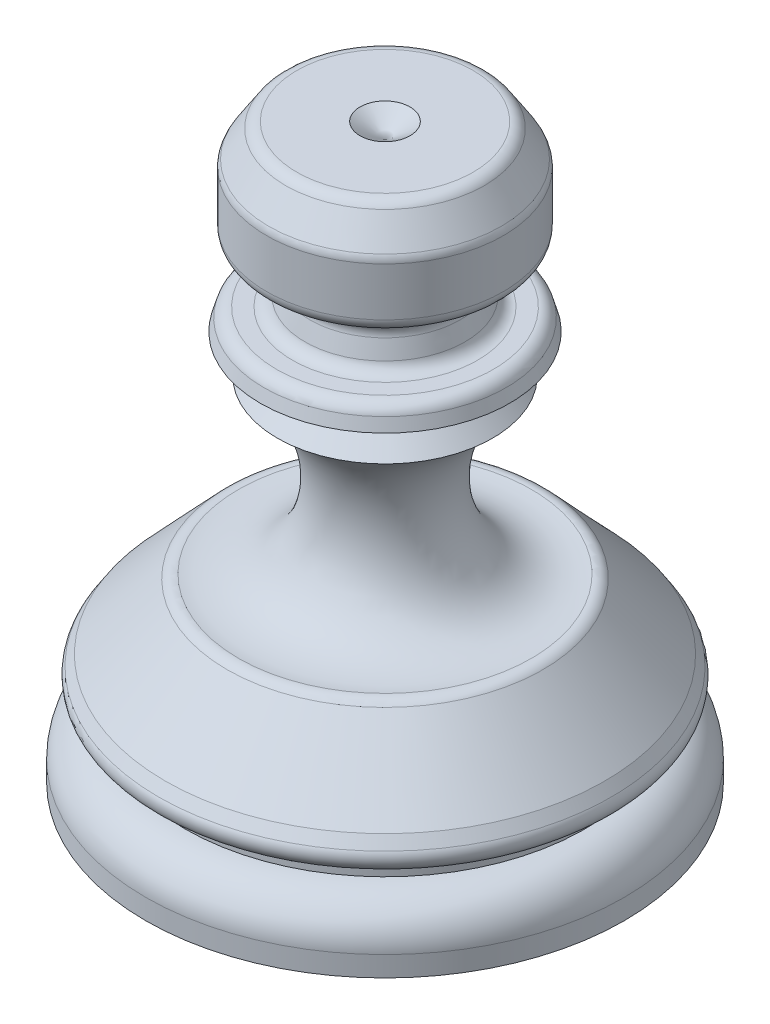
ISO-10303-21;
HEADER;
FILE_DESCRIPTION(('STEP AP214'),'2;1');
FILE_NAME('part.step','',(''),(''),'','','');
FILE_SCHEMA(('AUTOMOTIVE_DESIGN { 1 0 10303 214 1 1 1 1 }'));
ENDSEC;
DATA;
#1=APPLICATION_CONTEXT('core data for automotive mechanical design processes');
#2=APPLICATION_PROTOCOL_DEFINITION('international standard','automotive_design',2000,#1);
#3=PRODUCT_CONTEXT('',#1,'mechanical');
#4=PRODUCT('Part','Part','',(#3));
#5=PRODUCT_RELATED_PRODUCT_CATEGORY('part','',(#4));
#6=PRODUCT_DEFINITION_FORMATION('','',#4);
#7=PRODUCT_DEFINITION_CONTEXT('part definition',#1,'design');
#8=PRODUCT_DEFINITION('design','',#6,#7);
#9=PRODUCT_DEFINITION_SHAPE('','',#8);
#10=(LENGTH_UNIT() NAMED_UNIT(*) SI_UNIT(.MILLI.,.METRE.));
#11=(NAMED_UNIT(*) PLANE_ANGLE_UNIT() SI_UNIT($,.RADIAN.));
#12=(NAMED_UNIT(*) SI_UNIT($,.STERADIAN.) SOLID_ANGLE_UNIT());
#13=UNCERTAINTY_MEASURE_WITH_UNIT(LENGTH_MEASURE(1.E-05),#10,'distance_accuracy_value','');
#14=(GEOMETRIC_REPRESENTATION_CONTEXT(3) GLOBAL_UNCERTAINTY_ASSIGNED_CONTEXT((#13)) GLOBAL_UNIT_ASSIGNED_CONTEXT((#10,
#11,#12)) REPRESENTATION_CONTEXT('',''));
#15=CARTESIAN_POINT('',(0.,0.,0.));
#16=DIRECTION('',(0.,0.,1.));
#17=DIRECTION('',(1.,0.,0.));
#18=AXIS2_PLACEMENT_3D('',#15,#16,#17);
#19=CARTESIAN_POINT('',(0.,42.4652565748765,0.));
#20=DIRECTION('',(0.,1.,0.));
#21=DIRECTION('',(0.,0.,1.));
#22=AXIS2_PLACEMENT_3D('',#19,#20,#21);
#23=CONICAL_SURFACE('',#22,4.81231420290701,1.00227177906386);
#24=CARTESIAN_POINT('',(0.,39.390722500797,0.));
#25=VERTEX_POINT('',#24);
#26=VERTEX_LOOP('',#25);
#27=FACE_BOUND('',#26,.T.);
#28=CARTESIAN_POINT('',(0.,42.4652565748765,0.));
#29=DIRECTION('',(0.,1.,0.));
#30=DIRECTION('',(0.,0.,1.));
#31=AXIS2_PLACEMENT_3D('',#28,#29,#30);
#32=CIRCLE('',#31,4.81231420290701);
#33=CARTESIAN_POINT('',(0.,42.4652565748765,4.81231420290701));
#34=VERTEX_POINT('',#33);
#35=EDGE_CURVE('E49',#34,#34,#32,.T.);
#36=ORIENTED_EDGE('',*,*,#35,.T.);
#37=EDGE_LOOP('',(#36));
#38=FACE_BOUND('',#37,.T.);
#39=ADVANCED_FACE('F33',(#27,#38),#23,.F.);
#40=CARTESIAN_POINT('',(0.,-67.7820476432046,0.));
#41=DIRECTION('',(0.,1.,0.));
#42=DIRECTION('',(0.,0.,1.));
#43=AXIS2_PLACEMENT_3D('',#40,#41,#42);
#44=PLANE('',#43);
#45=CARTESIAN_POINT('',(0.,-67.7820476432046,0.));
#46=DIRECTION('',(0.,1.,0.));
#47=DIRECTION('',(0.,0.,1.));
#48=AXIS2_PLACEMENT_3D('',#45,#46,#47);
#49=CIRCLE('',#48,46.0654692720808);
#50=CARTESIAN_POINT('',(0.,-67.7820476432046,46.0654692720808));
#51=VERTEX_POINT('',#50);
#52=EDGE_CURVE('E75',#51,#51,#49,.T.);
#53=ORIENTED_EDGE('',*,*,#52,.F.);
#54=EDGE_LOOP('',(#53));
#55=FACE_BOUND('',#54,.T.);
#56=ADVANCED_FACE('F45',(#55),#44,.F.);
#57=CARTESIAN_POINT('',(0.,31.9167894242274,0.));
#58=DIRECTION('',(0.,1.,0.));
#59=DIRECTION('',(0.,0.,1.));
#60=AXIS2_PLACEMENT_3D('',#57,#58,#59);
#61=CYLINDRICAL_SURFACE('',#60,46.0654692720808);
#62=CARTESIAN_POINT('',(0.,-63.8855022021132,0.));
#63=DIRECTION('',(0.,1.,0.));
#64=DIRECTION('',(0.,0.,1.));
#65=AXIS2_PLACEMENT_3D('',#62,#63,#64);
#66=CIRCLE('',#65,46.0654692720808);
#67=CARTESIAN_POINT('',(0.,-63.8855022021132,46.0654692720808));
#68=VERTEX_POINT('',#67);
#69=EDGE_CURVE('E120',#68,#68,#66,.F.);
#70=ORIENTED_EDGE('',*,*,#69,.T.);
#71=EDGE_LOOP('',(#70));
#72=FACE_BOUND('',#71,.T.);
#73=ORIENTED_EDGE('',*,*,#52,.T.);
#74=EDGE_LOOP('',(#73));
#75=FACE_BOUND('',#74,.T.);
#76=ADVANCED_FACE('F147',(#72,#75),#61,.T.);
#77=CARTESIAN_POINT('',(0.,31.9167894242274,0.));
#78=DIRECTION('',(0.,1.,0.));
#79=DIRECTION('',(0.,0.,1.));
#80=AXIS2_PLACEMENT_3D('',#77,#78,#79);
#81=CYLINDRICAL_SURFACE('',#80,38.4975707488104);
#82=CARTESIAN_POINT('',(0.,-52.3172115304347,0.));
#83=DIRECTION('',(0.,1.,0.));
#84=DIRECTION('',(0.,0.,1.));
#85=AXIS2_PLACEMENT_3D('',#82,#83,#84);
#86=CIRCLE('',#85,38.4975707488104);
#87=CARTESIAN_POINT('',(0.,-52.3172115304347,38.4975707488104));
#88=VERTEX_POINT('',#87);
#89=EDGE_CURVE('E69',#88,#88,#86,.T.);
#90=ORIENTED_EDGE('',*,*,#89,.F.);
#91=EDGE_LOOP('',(#90));
#92=FACE_BOUND('',#91,.T.);
#93=CARTESIAN_POINT('',(0.,-56.2656803251844,0.));
#94=DIRECTION('',(0.,1.,0.));
#95=DIRECTION('',(0.,0.,1.));
#96=AXIS2_PLACEMENT_3D('',#93,#94,#95);
#97=CIRCLE('',#96,38.4975707488104);
#98=CARTESIAN_POINT('',(0.,-56.2656803251844,38.4975707488104));
#99=VERTEX_POINT('',#98);
#100=EDGE_CURVE('E72',#99,#99,#97,.T.);
#101=ORIENTED_EDGE('',*,*,#100,.T.);
#102=EDGE_LOOP('',(#101));
#103=FACE_BOUND('',#102,.T.);
#104=ADVANCED_FACE('F141',(#92,#103),#81,.T.);
#105=CARTESIAN_POINT('',(38.4975707488104,-52.3172115304347,0.));
#106=DIRECTION('',(0.,1.,0.));
#107=DIRECTION('',(0.,0.,1.));
#108=AXIS2_PLACEMENT_3D('',#105,#106,#107);
#109=PLANE('',#108);
#110=CARTESIAN_POINT('',(0.,-52.3172115304347,0.));
#111=DIRECTION('',(0.,1.,0.));
#112=DIRECTION('',(0.,0.,1.));
#113=AXIS2_PLACEMENT_3D('',#110,#111,#112);
#114=CIRCLE('',#113,41.4285568397049);
#115=CARTESIAN_POINT('',(0.,-52.3172115304347,41.4285568397049));
#116=VERTEX_POINT('',#115);
#117=EDGE_CURVE('E11',#116,#116,#114,.F.);
#118=ORIENTED_EDGE('',*,*,#117,.T.);
#119=EDGE_LOOP('',(#118));
#120=FACE_BOUND('',#119,.T.);
#121=ORIENTED_EDGE('',*,*,#89,.T.);
#122=EDGE_LOOP('',(#121));
#123=FACE_BOUND('',#122,.T.);
#124=ADVANCED_FACE('F138',(#120,#123),#109,.F.);
#125=CARTESIAN_POINT('',(0.,-52.3172115304347,0.));
#126=DIRECTION('',(0.,-1.,0.));
#127=DIRECTION('',(0.,0.,-1.));
#128=AXIS2_PLACEMENT_3D('',#125,#126,#127);
#129=CONICAL_SURFACE('',#128,46.0654692720808,0.568524547731041);
#130=CARTESIAN_POINT('',(0.,-48.4097027665951,0.));
#131=DIRECTION('',(0.,1.,0.));
#132=DIRECTION('',(0.,0.,1.));
#133=AXIS2_PLACEMENT_3D('',#130,#131,#132);
#134=CIRCLE('',#133,43.5690053396278);
#135=CARTESIAN_POINT('',(0.,-48.4097027665951,43.5690053396278));
#136=VERTEX_POINT('',#135);
#137=EDGE_CURVE('E40',#136,#136,#134,.T.);
#138=ORIENTED_EDGE('',*,*,#137,.T.);
#139=EDGE_LOOP('',(#138));
#140=FACE_BOUND('',#139,.T.);
#141=CARTESIAN_POINT('',(0.,-46.39450833831,0.));
#142=DIRECTION('',(0.,1.,0.));
#143=DIRECTION('',(0.,0.,1.));
#144=AXIS2_PLACEMENT_3D('',#141,#142,#143);
#145=CIRCLE('',#144,42.2815200104456);
#146=CARTESIAN_POINT('',(0.,-46.39450833831,42.2815200104456));
#147=VERTEX_POINT('',#146);
#148=EDGE_CURVE('E66',#147,#147,#145,.T.);
#149=ORIENTED_EDGE('',*,*,#148,.F.);
#150=EDGE_LOOP('',(#149));
#151=FACE_BOUND('',#150,.T.);
#152=ADVANCED_FACE('F125',(#140,#151),#129,.T.);
#153=CARTESIAN_POINT('',(0.,-38.1685316825813,0.));
#154=DIRECTION('',(0.,-1.,0.));
#155=DIRECTION('',(0.,0.,-1.));
#156=AXIS2_PLACEMENT_3D('',#153,#154,#155);
#157=CONICAL_SURFACE('',#156,34.5491019540606,0.754480183834404);
#158=CARTESIAN_POINT('',(0.,-33.7551049656459,0.));
#159=DIRECTION('',(0.,1.,0.));
#160=DIRECTION('',(0.,0.,1.));
#161=AXIS2_PLACEMENT_3D('',#158,#159,#160);
#162=CIRCLE('',#161,30.4004808401414);
#163=CARTESIAN_POINT('',(0.,-33.7551049656459,30.4004808401414));
#164=VERTEX_POINT('',#163);
#165=EDGE_CURVE('E117',#164,#164,#162,.F.);
#166=ORIENTED_EDGE('',*,*,#165,.T.);
#167=EDGE_LOOP('',(#166));
#168=FACE_BOUND('',#167,.T.);
#169=ORIENTED_EDGE('',*,*,#148,.T.);
#170=EDGE_LOOP('',(#169));
#171=FACE_BOUND('',#170,.T.);
#172=ADVANCED_FACE('F198',(#168,#171),#157,.T.);
#173=CARTESIAN_POINT('',(29.4620280235699,-32.7567509054635,0.));
#174=CARTESIAN_POINT('',(8.48706314067127,-37.0843237440966,0.));
#175=CARTESIAN_POINT('',(6.20876496623018,-6.64463608650512,0.));
#176=CARTESIAN_POINT('',(20.7294611724363,0.,0.));
#177=B_SPLINE_CURVE_WITH_KNOTS('',3,(#173,#174,#175,#176),.UNSPECIFIED.,.F.,.F.,(4,4),(0.,1.),.UNSPECIFIED.);
#178=CARTESIAN_POINT('',(0.,31.9167894242274,0.));
#179=DIRECTION('',(0.,1.,0.));
#180=AXIS1_PLACEMENT('',#178,#179);
#181=SURFACE_OF_REVOLUTION('',#177,#180);
#182=CARTESIAN_POINT('',(0.,-32.9808425191846,0.));
#183=DIRECTION('',(0.,1.,0.));
#184=DIRECTION('',(0.,0.,1.));
#185=AXIS2_PLACEMENT_3D('',#182,#183,#184);
#186=CIRCLE('',#185,28.1868113247116);
#187=CARTESIAN_POINT('',(0.,-32.9808425191846,28.1868113247116));
#188=VERTEX_POINT('',#187);
#189=EDGE_CURVE('E114',#188,#188,#186,.T.);
#190=ORIENTED_EDGE('',*,*,#189,.T.);
#191=EDGE_LOOP('',(#190));
#192=FACE_BOUND('',#191,.T.);
#193=CARTESIAN_POINT('',(0.,0.,0.));
#194=DIRECTION('',(0.,1.,0.));
#195=DIRECTION('',(0.,0.,1.));
#196=AXIS2_PLACEMENT_3D('',#193,#194,#195);
#197=CIRCLE('',#196,20.7294611724363);
#198=CARTESIAN_POINT('',(0.,0.,20.7294611724363));
#199=VERTEX_POINT('',#198);
#200=EDGE_CURVE('E63',#199,#199,#197,.T.);
#201=ORIENTED_EDGE('',*,*,#200,.F.);
#202=EDGE_LOOP('',(#201));
#203=FACE_BOUND('',#202,.T.);
#204=ADVANCED_FACE('F194',(#192,#203),#181,.T.);
#205=CARTESIAN_POINT('',(0.,0.,0.));
#206=DIRECTION('',(0.,-1.,0.));
#207=DIRECTION('',(0.,0.,-1.));
#208=AXIS2_PLACEMENT_3D('',#205,#206,#207);
#209=CONICAL_SURFACE('',#208,20.7294611724363,0.754480183834404);
#210=CARTESIAN_POINT('',(0.,5.10433293438933,0.));
#211=DIRECTION('',(0.,1.,0.));
#212=DIRECTION('',(0.,0.,1.));
#213=AXIS2_PLACEMENT_3D('',#210,#211,#212);
#214=CIRCLE('',#213,15.9313882141104);
#215=CARTESIAN_POINT('',(0.,5.10433293438933,15.9313882141104));
#216=VERTEX_POINT('',#215);
#217=EDGE_CURVE('E54',#216,#216,#214,.T.);
#218=ORIENTED_EDGE('',*,*,#217,.F.);
#219=EDGE_LOOP('',(#218));
#220=FACE_BOUND('',#219,.T.);
#221=ORIENTED_EDGE('',*,*,#200,.T.);
#222=EDGE_LOOP('',(#221));
#223=FACE_BOUND('',#222,.T.);
#224=ADVANCED_FACE('F197',(#220,#223),#209,.T.);
#225=CARTESIAN_POINT('',(0.,5.10433293438933,0.));
#226=DIRECTION('',(0.,1.,0.));
#227=DIRECTION('',(0.,0.,1.));
#228=AXIS2_PLACEMENT_3D('',#225,#226,#227);
#229=CONICAL_SURFACE('',#228,15.9313882141104,1.28856748082058);
#230=CARTESIAN_POINT('',(0.,7.44071070165423,0.));
#231=DIRECTION('',(0.,1.,0.));
#232=DIRECTION('',(0.,0.,1.));
#233=AXIS2_PLACEMENT_3D('',#230,#231,#232);
#234=CIRCLE('',#233,23.9887239913892);
#235=CARTESIAN_POINT('',(0.,7.44071070165423,23.9887239913892));
#236=VERTEX_POINT('',#235);
#237=EDGE_CURVE('E51',#236,#236,#234,.T.);
#238=ORIENTED_EDGE('',*,*,#237,.F.);
#239=EDGE_LOOP('',(#238));
#240=FACE_BOUND('',#239,.T.);
#241=ORIENTED_EDGE('',*,*,#217,.T.);
#242=EDGE_LOOP('',(#241));
#243=FACE_BOUND('',#242,.T.);
#244=ADVANCED_FACE('F203',(#240,#243),#229,.T.);
#245=CARTESIAN_POINT('',(0.,7.44071070165423,0.));
#246=DIRECTION('',(0.,-1.,0.));
#247=DIRECTION('',(0.,0.,-1.));
#248=AXIS2_PLACEMENT_3D('',#245,#246,#247);
#249=CONICAL_SURFACE('',#248,23.9887239913892,0.282228845974315);
#250=CARTESIAN_POINT('',(0.,9.72379143887595,0.));
#251=DIRECTION('',(0.,1.,0.));
#252=DIRECTION('',(0.,0.,1.));
#253=AXIS2_PLACEMENT_3D('',#250,#251,#252);
#254=CIRCLE('',#253,23.3267013051363);
#255=CARTESIAN_POINT('',(0.,9.72379143887595,23.3267013051363));
#256=VERTEX_POINT('',#255);
#257=EDGE_CURVE('E84',#256,#256,#254,.F.);
#258=ORIENTED_EDGE('',*,*,#257,.T.);
#259=EDGE_LOOP('',(#258));
#260=FACE_BOUND('',#259,.T.);
#261=ORIENTED_EDGE('',*,*,#237,.T.);
#262=EDGE_LOOP('',(#261));
#263=FACE_BOUND('',#262,.T.);
#264=ADVANCED_FACE('F209',(#260,#263),#249,.T.);
#265=CARTESIAN_POINT('',(22.7952989715946,11.5564090464245,0.));
#266=DIRECTION('',(0.,-1.,0.));
#267=DIRECTION('',(0.,0.,-1.));
#268=AXIS2_PLACEMENT_3D('',#265,#266,#267);
#269=PLANE('',#268);
#270=CARTESIAN_POINT('',(0.,11.5564090464245,0.));
#271=DIRECTION('',(0.,-1.,0.));
#272=DIRECTION('',(0.,0.,-1.));
#273=AXIS2_PLACEMENT_3D('',#270,#271,#272);
#274=CIRCLE('',#273,20.8871910774779);
#275=CARTESIAN_POINT('',(0.,11.5564090464245,-20.8871910774779));
#276=VERTEX_POINT('',#275);
#277=EDGE_CURVE('E81',#276,#276,#274,.F.);
#278=ORIENTED_EDGE('',*,*,#277,.T.);
#279=EDGE_LOOP('',(#278));
#280=FACE_BOUND('',#279,.T.);
#281=CARTESIAN_POINT('',(0.,11.5564090464245,0.));
#282=DIRECTION('',(0.,-1.,0.));
#283=DIRECTION('',(0.,0.,-1.));
#284=AXIS2_PLACEMENT_3D('',#281,#282,#283);
#285=CIRCLE('',#284,17.8394961082271);
#286=CARTESIAN_POINT('',(0.,11.5564090464245,-17.8394961082271));
#287=VERTEX_POINT('',#286);
#288=EDGE_CURVE('E78',#287,#287,#285,.T.);
#289=ORIENTED_EDGE('',*,*,#288,.T.);
#290=EDGE_LOOP('',(#289));
#291=FACE_BOUND('',#290,.T.);
#292=ADVANCED_FACE('F287',(#280,#291),#269,.F.);
#293=CARTESIAN_POINT('',(0.,11.5564090464245,0.));
#294=DIRECTION('',(0.,-1.,0.));
#295=DIRECTION('',(0.,0.,-1.));
#296=AXIS2_PLACEMENT_3D('',#293,#294,#295);
#297=CONICAL_SURFACE('',#296,15.9313882141104,0.282228845974315);
#298=CARTESIAN_POINT('',(0.,13.389026653973,0.));
#299=DIRECTION('',(0.,-1.,0.));
#300=DIRECTION('',(0.,0.,-1.));
#301=AXIS2_PLACEMENT_3D('',#298,#299,#300);
#302=CIRCLE('',#301,15.3999858805687);
#303=CARTESIAN_POINT('',(0.,13.389026653973,-15.3999858805687));
#304=VERTEX_POINT('',#303);
#305=EDGE_CURVE('E90',#304,#304,#302,.F.);
#306=ORIENTED_EDGE('',*,*,#305,.T.);
#307=EDGE_LOOP('',(#306));
#308=FACE_BOUND('',#307,.T.);
#309=CARTESIAN_POINT('',(0.,16.593856404983,0.));
#310=DIRECTION('',(0.,-1.,0.));
#311=DIRECTION('',(0.,0.,-1.));
#312=AXIS2_PLACEMENT_3D('',#309,#310,#311);
#313=CIRCLE('',#312,14.4706845351732);
#314=CARTESIAN_POINT('',(0.,16.593856404983,-14.4706845351732));
#315=VERTEX_POINT('',#314);
#316=EDGE_CURVE('E87',#315,#315,#313,.T.);
#317=ORIENTED_EDGE('',*,*,#316,.T.);
#318=EDGE_LOOP('',(#317));
#319=FACE_BOUND('',#318,.T.);
#320=ADVANCED_FACE('F296',(#308,#319),#297,.T.);
#321=CARTESIAN_POINT('',(0.,18.4187258380233,0.));
#322=DIRECTION('',(0.,1.,0.));
#323=DIRECTION('',(0.,0.,1.));
#324=AXIS2_PLACEMENT_3D('',#321,#322,#323);
#325=CONICAL_SURFACE('',#324,13.9415289322083,1.00227177906386);
#326=CARTESIAN_POINT('',(0.,19.4416872973573,0.));
#327=DIRECTION('',(0.,1.,0.));
#328=DIRECTION('',(0.,0.,1.));
#329=AXIS2_PLACEMENT_3D('',#326,#327,#328);
#330=CIRCLE('',#329,15.5426859989919);
#331=CARTESIAN_POINT('',(0.,19.4416872973573,15.5426859989919));
#332=VERTEX_POINT('',#331);
#333=EDGE_CURVE('E96',#332,#332,#330,.T.);
#334=ORIENTED_EDGE('',*,*,#333,.T.);
#335=EDGE_LOOP('',(#334));
#336=FACE_BOUND('',#335,.T.);
#337=CARTESIAN_POINT('',(0.,23.3262095178621,0.));
#338=DIRECTION('',(0.,-1.,0.));
#339=DIRECTION('',(0.,0.,-1.));
#340=AXIS2_PLACEMENT_3D('',#337,#338,#339);
#341=CIRCLE('',#340,21.6228077354342);
#342=CARTESIAN_POINT('',(0.,23.3262095178621,-21.6228077354342));
#343=VERTEX_POINT('',#342);
#344=EDGE_CURVE('E93',#343,#343,#341,.T.);
#345=ORIENTED_EDGE('',*,*,#344,.T.);
#346=EDGE_LOOP('',(#345));
#347=FACE_BOUND('',#346,.T.);
#348=ADVANCED_FACE('F306',(#336,#347),#325,.T.);
#349=CARTESIAN_POINT('',(0.,31.9167894242274,0.));
#350=DIRECTION('',(0.,1.,0.));
#351=DIRECTION('',(0.,0.,1.));
#352=AXIS2_PLACEMENT_3D('',#349,#350,#351);
#353=CYLINDRICAL_SURFACE('',#352,22.7952989715946);
#354=CARTESIAN_POINT('',(0.,25.466658017785,0.));
#355=DIRECTION('',(0.,-1.,0.));
#356=DIRECTION('',(0.,0.,-1.));
#357=AXIS2_PLACEMENT_3D('',#354,#355,#356);
#358=CIRCLE('',#357,22.7952989715946);
#359=CARTESIAN_POINT('',(0.,25.466658017785,-22.7952989715946));
#360=VERTEX_POINT('',#359);
#361=EDGE_CURVE('E102',#360,#360,#358,.F.);
#362=ORIENTED_EDGE('',*,*,#361,.T.);
#363=EDGE_LOOP('',(#362));
#364=FACE_BOUND('',#363,.T.);
#365=CARTESIAN_POINT('',(0.,34.794095345551,0.));
#366=DIRECTION('',(0.,-1.,0.));
#367=DIRECTION('',(0.,0.,-1.));
#368=AXIS2_PLACEMENT_3D('',#365,#366,#367);
#369=CIRCLE('',#368,22.7952989715946);
#370=CARTESIAN_POINT('',(0.,34.794095345551,-22.7952989715946));
#371=VERTEX_POINT('',#370);
#372=EDGE_CURVE('E99',#371,#371,#369,.T.);
#373=ORIENTED_EDGE('',*,*,#372,.T.);
#374=EDGE_LOOP('',(#373));
#375=FACE_BOUND('',#374,.T.);
#376=ADVANCED_FACE('F316',(#364,#375),#353,.T.);
#377=CARTESIAN_POINT('',(0.,35.5362191527481,0.));
#378=DIRECTION('',(0.,-1.,0.));
#379=DIRECTION('',(0.,0.,-1.));
#380=AXIS2_PLACEMENT_3D('',#377,#378,#379);
#381=CONICAL_SURFACE('',#380,22.7952989715946,0.568524547731041);
#382=CARTESIAN_POINT('',(0.,41.2927653387161,0.));
#383=DIRECTION('',(0.,1.,0.));
#384=DIRECTION('',(0.,0.,1.));
#385=AXIS2_PLACEMENT_3D('',#382,#383,#384);
#386=CIRCLE('',#385,19.1175055750039);
#387=CARTESIAN_POINT('',(0.,41.2927653387161,19.1175055750039));
#388=VERTEX_POINT('',#387);
#389=EDGE_CURVE('E111',#388,#388,#386,.F.);
#390=ORIENTED_EDGE('',*,*,#389,.T.);
#391=EDGE_LOOP('',(#390));
#392=FACE_BOUND('',#391,.T.);
#393=CARTESIAN_POINT('',(0.,36.1616041093906,0.));
#394=DIRECTION('',(0.,1.,0.));
#395=DIRECTION('',(0.,0.,1.));
#396=AXIS2_PLACEMENT_3D('',#393,#394,#395);
#397=CIRCLE('',#396,22.3957474715175);
#398=CARTESIAN_POINT('',(0.,36.1616041093906,22.3957474715175));
#399=VERTEX_POINT('',#398);
#400=EDGE_CURVE('E108',#399,#399,#397,.T.);
#401=ORIENTED_EDGE('',*,*,#400,.T.);
#402=EDGE_LOOP('',(#401));
#403=FACE_BOUND('',#402,.T.);
#404=ADVANCED_FACE('F327',(#392,#403),#381,.T.);
#405=CARTESIAN_POINT('',(13.9415289322083,42.4652565748765,0.));
#406=DIRECTION('',(0.,-1.,0.));
#407=DIRECTION('',(0.,0.,-1.));
#408=AXIS2_PLACEMENT_3D('',#405,#406,#407);
#409=PLANE('',#408);
#410=CARTESIAN_POINT('',(0.,42.4652565748765,0.));
#411=DIRECTION('',(0.,-1.,0.));
#412=DIRECTION('',(0.,0.,-1.));
#413=AXIS2_PLACEMENT_3D('',#410,#411,#412);
#414=CIRCLE('',#413,16.9770570750811);
#415=CARTESIAN_POINT('',(0.,42.4652565748765,-16.9770570750811));
#416=VERTEX_POINT('',#415);
#417=EDGE_CURVE('E105',#416,#416,#414,.F.);
#418=ORIENTED_EDGE('',*,*,#417,.T.);
#419=EDGE_LOOP('',(#418));
#420=FACE_BOUND('',#419,.T.);
#421=ORIENTED_EDGE('',*,*,#35,.F.);
#422=EDGE_LOOP('',(#421));
#423=FACE_BOUND('',#422,.T.);
#424=ADVANCED_FACE('F165',(#420,#423),#409,.F.);
#425=CARTESIAN_POINT('',(0.,9.01640904642447,0.));
#426=DIRECTION('',(0.,-1.,0.));
#427=DIRECTION('',(0.,0.,-1.));
#428=AXIS2_PLACEMENT_3D('',#425,#426,#427);
#429=TOROIDAL_SURFACE('',#428,20.8871910774779,2.54);
#430=ORIENTED_EDGE('',*,*,#257,.F.);
#431=EDGE_LOOP('',(#430));
#432=FACE_BOUND('',#431,.T.);
#433=ORIENTED_EDGE('',*,*,#277,.F.);
#434=EDGE_LOOP('',(#433));
#435=FACE_BOUND('',#434,.T.);
#436=ADVANCED_FACE('F161',(#432,#435),#429,.T.);
#437=CARTESIAN_POINT('',(0.,14.0964090464245,0.));
#438=DIRECTION('',(0.,-1.,0.));
#439=DIRECTION('',(0.,0.,-1.));
#440=AXIS2_PLACEMENT_3D('',#437,#438,#439);
#441=TOROIDAL_SURFACE('',#440,17.8394961082271,2.54);
#442=ORIENTED_EDGE('',*,*,#288,.F.);
#443=EDGE_LOOP('',(#442));
#444=FACE_BOUND('',#443,.T.);
#445=ORIENTED_EDGE('',*,*,#305,.F.);
#446=EDGE_LOOP('',(#445));
#447=FACE_BOUND('',#446,.T.);
#448=ADVANCED_FACE('F164',(#444,#447),#441,.F.);
#449=CARTESIAN_POINT('',(0.,17.3012387974345,0.));
#450=DIRECTION('',(0.,1.,0.));
#451=DIRECTION('',(0.,0.,1.));
#452=AXIS2_PLACEMENT_3D('',#449,#450,#451);
#453=TOROIDAL_SURFACE('',#452,16.9101947628315,2.54);
#454=ORIENTED_EDGE('',*,*,#316,.F.);
#455=EDGE_LOOP('',(#454));
#456=FACE_BOUND('',#455,.T.);
#457=ORIENTED_EDGE('',*,*,#333,.F.);
#458=EDGE_LOOP('',(#457));
#459=FACE_BOUND('',#458,.T.);
#460=ADVANCED_FACE('F169',(#456,#459),#453,.F.);
#461=CARTESIAN_POINT('',(0.,25.466658017785,0.));
#462=DIRECTION('',(0.,-1.,0.));
#463=DIRECTION('',(0.,0.,-1.));
#464=AXIS2_PLACEMENT_3D('',#461,#462,#463);
#465=TOROIDAL_SURFACE('',#464,20.2552989715946,2.54);
#466=ORIENTED_EDGE('',*,*,#344,.F.);
#467=EDGE_LOOP('',(#466));
#468=FACE_BOUND('',#467,.T.);
#469=ORIENTED_EDGE('',*,*,#361,.F.);
#470=EDGE_LOOP('',(#469));
#471=FACE_BOUND('',#470,.T.);
#472=ADVANCED_FACE('F173',(#468,#471),#465,.T.);
#473=CARTESIAN_POINT('',(0.,39.9252565748765,0.));
#474=DIRECTION('',(0.,-1.,0.));
#475=DIRECTION('',(0.,0.,-1.));
#476=AXIS2_PLACEMENT_3D('',#473,#474,#475);
#477=TOROIDAL_SURFACE('',#476,16.9770570750811,2.54);
#478=ORIENTED_EDGE('',*,*,#389,.F.);
#479=EDGE_LOOP('',(#478));
#480=FACE_BOUND('',#479,.T.);
#481=ORIENTED_EDGE('',*,*,#417,.F.);
#482=EDGE_LOOP('',(#481));
#483=FACE_BOUND('',#482,.T.);
#484=ADVANCED_FACE('F177',(#480,#483),#477,.T.);
#485=CARTESIAN_POINT('',(0.,34.794095345551,0.));
#486=DIRECTION('',(0.,-1.,0.));
#487=DIRECTION('',(0.,0.,-1.));
#488=AXIS2_PLACEMENT_3D('',#485,#486,#487);
#489=TOROIDAL_SURFACE('',#488,20.2552989715946,2.54);
#490=ORIENTED_EDGE('',*,*,#372,.F.);
#491=EDGE_LOOP('',(#490));
#492=FACE_BOUND('',#491,.T.);
#493=ORIENTED_EDGE('',*,*,#400,.F.);
#494=EDGE_LOOP('',(#493));
#495=FACE_BOUND('',#494,.T.);
#496=ADVANCED_FACE('F181',(#492,#495),#489,.T.);
#497=CARTESIAN_POINT('',(0.,-35.4947763879163,0.));
#498=DIRECTION('',(0.,-1.,0.));
#499=DIRECTION('',(0.,0.,-1.));
#500=AXIS2_PLACEMENT_3D('',#497,#498,#499);
#501=TOROIDAL_SURFACE('',#500,28.5497665611303,2.54);
#502=ORIENTED_EDGE('',*,*,#165,.F.);
#503=EDGE_LOOP('',(#502));
#504=FACE_BOUND('',#503,.T.);
#505=ORIENTED_EDGE('',*,*,#189,.F.);
#506=EDGE_LOOP('',(#505));
#507=FACE_BOUND('',#506,.T.);
#508=ADVANCED_FACE('F134',(#504,#507),#501,.T.);
#509=CARTESIAN_POINT('',(0.,-63.8855022021132,0.));
#510=DIRECTION('',(0.,1.,0.));
#511=DIRECTION('',(0.,0.,1.));
#512=AXIS2_PLACEMENT_3D('',#509,#510,#511);
#513=TOROIDAL_SURFACE('',#512,38.4454692720808,7.62);
#514=ORIENTED_EDGE('',*,*,#69,.F.);
#515=EDGE_LOOP('',(#514));
#516=FACE_BOUND('',#515,.T.);
#517=ORIENTED_EDGE('',*,*,#100,.F.);
#518=EDGE_LOOP('',(#517));
#519=FACE_BOUND('',#518,.T.);
#520=ADVANCED_FACE('F129',(#516,#519),#513,.T.);
#521=CARTESIAN_POINT('',(0.,-49.7772115304347,0.));
#522=DIRECTION('',(0.,1.,0.));
#523=DIRECTION('',(0.,0.,1.));
#524=AXIS2_PLACEMENT_3D('',#521,#522,#523);
#525=TOROIDAL_SURFACE('',#524,41.4285568397049,2.54);
#526=ORIENTED_EDGE('',*,*,#117,.F.);
#527=EDGE_LOOP('',(#526));
#528=FACE_BOUND('',#527,.T.);
#529=ORIENTED_EDGE('',*,*,#137,.F.);
#530=EDGE_LOOP('',(#529));
#531=FACE_BOUND('',#530,.T.);
#532=ADVANCED_FACE('F35',(#528,#531),#525,.T.);
#533=CLOSED_SHELL('',(#39,#56,#76,#104,#124,#152,#172,#204,#224,#244,#264,#292,#320,#348,#376,
#404,#424,#436,#448,#460,#472,#484,#496,#508,#520,#532));
#534=MANIFOLD_SOLID_BREP('B2',#533);
#535=ADVANCED_BREP_SHAPE_REPRESENTATION('',(#18,#534),#14);
#536=SHAPE_DEFINITION_REPRESENTATION(#9,#535);
ENDSEC;
END-ISO-10303-21;
